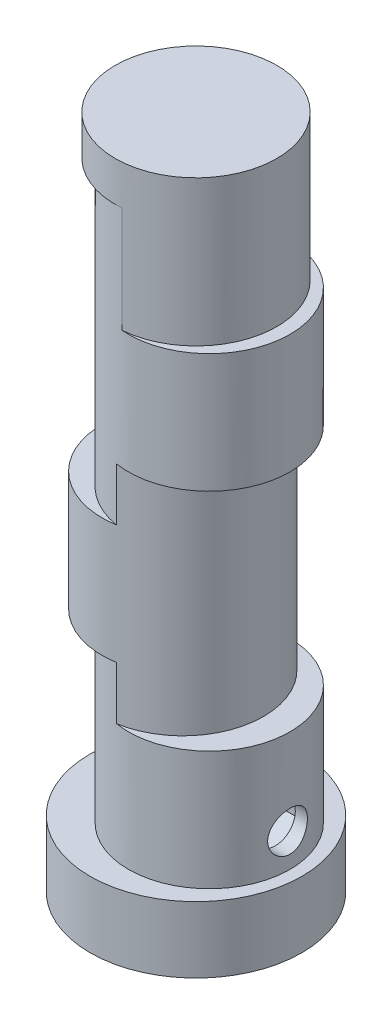
ISO-10303-21;
HEADER;
FILE_DESCRIPTION(('STEP AP214'),'2;1');
FILE_NAME('part.step','',(''),(''),'','','');
FILE_SCHEMA(('AUTOMOTIVE_DESIGN { 1 0 10303 214 1 1 1 1 }'));
ENDSEC;
DATA;
#1=APPLICATION_CONTEXT('core data for automotive mechanical design processes');
#2=APPLICATION_PROTOCOL_DEFINITION('international standard','automotive_design',2000,#1);
#3=PRODUCT_CONTEXT('',#1,'mechanical');
#4=PRODUCT('Part','Part','',(#3));
#5=PRODUCT_RELATED_PRODUCT_CATEGORY('part','',(#4));
#6=PRODUCT_DEFINITION_FORMATION('','',#4);
#7=PRODUCT_DEFINITION_CONTEXT('part definition',#1,'design');
#8=PRODUCT_DEFINITION('design','',#6,#7);
#9=PRODUCT_DEFINITION_SHAPE('','',#8);
#10=(LENGTH_UNIT() NAMED_UNIT(*) SI_UNIT(.MILLI.,.METRE.));
#11=(NAMED_UNIT(*) PLANE_ANGLE_UNIT() SI_UNIT($,.RADIAN.));
#12=(NAMED_UNIT(*) SI_UNIT($,.STERADIAN.) SOLID_ANGLE_UNIT());
#13=UNCERTAINTY_MEASURE_WITH_UNIT(LENGTH_MEASURE(1.E-05),#10,'distance_accuracy_value','');
#14=(GEOMETRIC_REPRESENTATION_CONTEXT(3) GLOBAL_UNCERTAINTY_ASSIGNED_CONTEXT((#13)) GLOBAL_UNIT_ASSIGNED_CONTEXT((#10,
#11,#12)) REPRESENTATION_CONTEXT('',''));
#15=CARTESIAN_POINT('',(0.,0.,0.));
#16=DIRECTION('',(0.,0.,1.));
#17=DIRECTION('',(1.,0.,0.));
#18=AXIS2_PLACEMENT_3D('',#15,#16,#17);
#19=CARTESIAN_POINT('',(0.,25.,0.));
#20=DIRECTION('',(0.,-1.,0.));
#21=DIRECTION('',(0.,0.,-1.));
#22=AXIS2_PLACEMENT_3D('',#19,#20,#21);
#23=CYLINDRICAL_SURFACE('',#22,3.15);
#24=CARTESIAN_POINT('',(0.,0.,0.));
#25=DIRECTION('',(0.,-1.,0.));
#26=DIRECTION('',(0.,0.,-1.));
#27=AXIS2_PLACEMENT_3D('',#24,#25,#26);
#28=CIRCLE('',#27,3.15);
#29=CARTESIAN_POINT('',(0.,0.,-3.15));
#30=VERTEX_POINT('',#29);
#31=EDGE_CURVE('E149',#30,#30,#28,.T.);
#32=ORIENTED_EDGE('',*,*,#31,.T.);
#33=EDGE_LOOP('',(#32));
#34=FACE_BOUND('',#33,.T.);
#35=CARTESIAN_POINT('',(0.,25.,0.));
#36=DIRECTION('',(0.,-1.,0.));
#37=DIRECTION('',(0.,0.,-1.));
#38=AXIS2_PLACEMENT_3D('',#35,#36,#37);
#39=CIRCLE('',#38,3.15);
#40=CARTESIAN_POINT('',(0.,25.,-3.15));
#41=VERTEX_POINT('',#40);
#42=EDGE_CURVE('E160',#41,#41,#39,.T.);
#43=ORIENTED_EDGE('',*,*,#42,.F.);
#44=EDGE_LOOP('',(#43));
#45=FACE_BOUND('',#44,.T.);
#46=CARTESIAN_POINT('',(0.,10.7331615074619,0.));
#47=DIRECTION('',(0.,-0.866025403784439,0.5));
#48=DIRECTION('',(0.,-0.5,-0.866025403784439));
#49=AXIS2_PLACEMENT_3D('',#46,#47,#48);
#50=ELLIPSE('',#49,3.63730669589464,3.15);
#51=CARTESIAN_POINT('',(3.15,10.7331615074619,0.));
#52=VERTEX_POINT('',#51);
#53=CARTESIAN_POINT('',(1.44308696896618,9.11658075373095,-2.8));
#54=VERTEX_POINT('',#53);
#55=EDGE_CURVE('E11',#52,#54,#50,.F.);
#56=ORIENTED_EDGE('',*,*,#55,.F.);
#57=CARTESIAN_POINT('',(0.,10.7331615074619,0.));
#58=DIRECTION('',(0.,-0.866025403784438,-0.5));
#59=DIRECTION('',(0.,-0.5,0.866025403784438));
#60=AXIS2_PLACEMENT_3D('',#57,#58,#59);
#61=ELLIPSE('',#60,3.63730669589464,3.15);
#62=CARTESIAN_POINT('',(1.44308696896618,9.11658075373095,2.8));
#63=VERTEX_POINT('',#62);
#64=EDGE_CURVE('E43',#63,#52,#61,.F.);
#65=ORIENTED_EDGE('',*,*,#64,.F.);
#66=DIRECTION('',(0.,-1.,0.));
#67=VECTOR('',#66,1.);
#68=CARTESIAN_POINT('',(1.44308696896617,25.,2.8));
#69=LINE('',#68,#67);
#70=CARTESIAN_POINT('',(1.44308696896619,5.88341924626905,2.8));
#71=VERTEX_POINT('',#70);
#72=EDGE_CURVE('E259',#71,#63,#69,.F.);
#73=ORIENTED_EDGE('',*,*,#72,.F.);
#74=CARTESIAN_POINT('',(0.,4.2668384925381,0.));
#75=DIRECTION('',(0.,0.866025403784439,-0.5));
#76=DIRECTION('',(0.,-0.5,-0.866025403784439));
#77=AXIS2_PLACEMENT_3D('',#74,#75,#76);
#78=ELLIPSE('',#77,3.63730669589464,3.15);
#79=CARTESIAN_POINT('',(3.15,4.26683849253809,0.));
#80=VERTEX_POINT('',#79);
#81=EDGE_CURVE('E257',#80,#71,#78,.F.);
#82=ORIENTED_EDGE('',*,*,#81,.F.);
#83=CARTESIAN_POINT('',(0.,4.2668384925381,0.));
#84=DIRECTION('',(0.,0.866025403784439,0.5));
#85=DIRECTION('',(0.,-0.5,0.866025403784439));
#86=AXIS2_PLACEMENT_3D('',#83,#84,#85);
#87=ELLIPSE('',#86,3.63730669589464,3.15);
#88=CARTESIAN_POINT('',(1.44308696896618,5.88341924626905,-2.8));
#89=VERTEX_POINT('',#88);
#90=EDGE_CURVE('E255',#89,#80,#87,.F.);
#91=ORIENTED_EDGE('',*,*,#90,.F.);
#92=DIRECTION('',(0.,-1.,0.));
#93=VECTOR('',#92,1.);
#94=CARTESIAN_POINT('',(1.44308696896618,25.,-2.8));
#95=LINE('',#94,#93);
#96=EDGE_CURVE('E251',#54,#89,#95,.T.);
#97=ORIENTED_EDGE('',*,*,#96,.F.);
#98=EDGE_LOOP('',(#56,#65,#73,#82,#91,#97));
#99=FACE_BOUND('',#98,.T.);
#100=ADVANCED_FACE('F35',(#34,#45,#99),#23,.F.);
#101=CARTESIAN_POINT('',(1.,14.,0.));
#102=DIRECTION('',(0.,-1.,0.));
#103=DIRECTION('',(0.,0.,-1.));
#104=AXIS2_PLACEMENT_3D('',#101,#102,#103);
#105=CYLINDRICAL_SURFACE('',#104,6.1);
#106=CARTESIAN_POINT('',(1.,14.,0.));
#107=DIRECTION('',(0.,1.,0.));
#108=DIRECTION('',(0.,0.,1.));
#109=AXIS2_PLACEMENT_3D('',#106,#107,#108);
#110=CIRCLE('',#109,6.1);
#111=CARTESIAN_POINT('',(0.,14.,6.01747455333215));
#112=VERTEX_POINT('',#111);
#113=CARTESIAN_POINT('',(0.,14.,-6.01747455333215));
#114=VERTEX_POINT('',#113);
#115=EDGE_CURVE('E228',#112,#114,#110,.T.);
#116=ORIENTED_EDGE('',*,*,#115,.F.);
#117=DIRECTION('',(0.,-1.,0.));
#118=VECTOR('',#117,1.);
#119=CARTESIAN_POINT('',(0.,18.,6.01747455333215));
#120=LINE('',#119,#118);
#121=CARTESIAN_POINT('',(0.,18.,6.01747455333215));
#122=VERTEX_POINT('',#121);
#123=EDGE_CURVE('E237',#122,#112,#120,.T.);
#124=ORIENTED_EDGE('',*,*,#123,.F.);
#125=CARTESIAN_POINT('',(1.,18.,0.));
#126=DIRECTION('',(0.,1.,0.));
#127=DIRECTION('',(0.,0.,-1.));
#128=AXIS2_PLACEMENT_3D('',#125,#126,#127);
#129=CIRCLE('',#128,6.1);
#130=CARTESIAN_POINT('',(0.,18.,-6.01747455333215));
#131=VERTEX_POINT('',#130);
#132=EDGE_CURVE('E491',#131,#122,#129,.T.);
#133=ORIENTED_EDGE('',*,*,#132,.F.);
#134=DIRECTION('',(0.,-1.,0.));
#135=VECTOR('',#134,1.);
#136=CARTESIAN_POINT('',(0.,18.,-6.01747455333215));
#137=LINE('',#136,#135);
#138=EDGE_CURVE('E239',#131,#114,#137,.T.);
#139=ORIENTED_EDGE('',*,*,#138,.T.);
#140=EDGE_LOOP('',(#116,#124,#133,#139));
#141=FACE_BOUND('',#140,.T.);
#142=CARTESIAN_POINT('',(1.,5.,0.));
#143=DIRECTION('',(0.,1.,0.));
#144=DIRECTION('',(0.,0.,1.));
#145=AXIS2_PLACEMENT_3D('',#142,#143,#144);
#146=CIRCLE('',#145,6.1);
#147=CARTESIAN_POINT('',(1.,5.,6.1));
#148=VERTEX_POINT('',#147);
#149=EDGE_CURVE('E248',#148,#148,#146,.T.);
#150=ORIENTED_EDGE('',*,*,#149,.T.);
#151=EDGE_LOOP('',(#150));
#152=FACE_BOUND('',#151,.T.);
#153=CARTESIAN_POINT('',(6.91269819963779,7.5,1.5));
#154=CARTESIAN_POINT('',(6.9126998060556,7.41712278064616,1.4999975690533));
#155=CARTESIAN_POINT('',(6.9144597343511,7.3342183610392,1.49310797376088));
#156=CARTESIAN_POINT('',(6.92129202077056,7.17078706736375,1.46577363636686));
#157=CARTESIAN_POINT('',(6.92636637043722,7.090261653199,1.44532074434831));
#158=CARTESIAN_POINT('',(6.93921883489659,6.93397594703489,1.39155918794369));
#159=CARTESIAN_POINT('',(6.94699353112061,6.85820977249492,1.35826677220773));
#160=CARTESIAN_POINT('',(6.96436644289978,6.71333076700223,1.27982033209297));
#161=CARTESIAN_POINT('',(6.97396472033899,6.64421816196138,1.23466590515153));
#162=CARTESIAN_POINT('',(6.994132084337,6.51313621507288,1.13275031899138));
#163=CARTESIAN_POINT('',(7.00471626796872,6.45132943399605,1.07578302432095));
#164=CARTESIAN_POINT('',(7.02553174748576,6.3380445657549,0.952302942094368));
#165=CARTESIAN_POINT('',(7.03576301112202,6.28656742043074,0.885789285063226));
#166=CARTESIAN_POINT('',(7.0548865456579,6.19474100793115,0.743994133707522));
#167=CARTESIAN_POINT('',(7.06375892305911,6.15455098028312,0.668606601038824));
#168=CARTESIAN_POINT('',(7.07899300802557,6.08747431780344,0.511891405903731));
#169=CARTESIAN_POINT('',(7.08535507359341,6.06058578586943,0.430564592416675));
#170=CARTESIAN_POINT('',(7.09474498214789,6.02139477930321,0.265973555788015));
#171=CARTESIAN_POINT('',(7.09783581801544,6.00881636945155,0.182778691625863));
#172=CARTESIAN_POINT('',(7.10055435441945,5.99773698857898,0.0154060764093003));
#173=CARTESIAN_POINT('',(7.10018255097244,5.99923400128075,-0.0687715321434836));
#174=CARTESIAN_POINT('',(7.09606476582421,6.01606353614531,-0.233807979580636));
#175=CARTESIAN_POINT('',(7.09239141026846,6.03109827413386,-0.31469926888962));
#176=CARTESIAN_POINT('',(7.0821675675927,6.07409839846138,-0.47277371209518));
#177=CARTESIAN_POINT('',(7.07561693016091,6.10206446034839,-0.549956672031562));
#178=CARTESIAN_POINT('',(7.06026266570478,6.17037737007251,-0.699213839862234));
#179=CARTESIAN_POINT('',(7.05143969560672,6.21083113686827,-0.771237040929525));
#180=CARTESIAN_POINT('',(7.03249929340938,6.30289022076885,-0.907577574612574));
#181=CARTESIAN_POINT('',(7.02238164279837,6.35449742132718,-0.971893602881658));
#182=CARTESIAN_POINT('',(7.00164301846912,6.46899831379271,-1.092769508958));
#183=CARTESIAN_POINT('',(6.99101580290047,6.53215230406986,-1.14908200378442));
#184=CARTESIAN_POINT('',(6.97069917825497,6.66711859706198,-1.25037099898459));
#185=CARTESIAN_POINT('',(6.9610098101475,6.73893127771983,-1.29534700426727));
#186=CARTESIAN_POINT('',(6.94364431591754,6.88964978893113,-1.37283781707484));
#187=CARTESIAN_POINT('',(6.93597757256019,6.96858647377591,-1.4052948607831));
#188=CARTESIAN_POINT('',(6.92364684203902,7.1310295864958,-1.45640197195425));
#189=CARTESIAN_POINT('',(6.91898223595094,7.21453506860794,-1.4750548854123));
#190=CARTESIAN_POINT('',(6.91331334341029,7.38145580682887,-1.49761754049186));
#191=CARTESIAN_POINT('',(6.91221845954046,7.4648187074306,-1.50189228237621));
#192=CARTESIAN_POINT('',(6.91356667440519,7.63106665627221,-1.49657499228901));
#193=CARTESIAN_POINT('',(6.91600945919373,7.71395174625948,-1.48698419079807));
#194=CARTESIAN_POINT('',(6.92407112693765,7.8755477552966,-1.45452765993443));
#195=CARTESIAN_POINT('',(6.92963951335311,7.95430379281553,-1.43187283482642));
#196=CARTESIAN_POINT('',(6.94327735477713,8.10690068833243,-1.37416441539949));
#197=CARTESIAN_POINT('',(6.95134709856602,8.18074097761367,-1.33910938941819));
#198=CARTESIAN_POINT('',(6.96927028778677,8.32296142202863,-1.25682618529392));
#199=CARTESIAN_POINT('',(6.97915477918457,8.39121079291479,-1.20937886701303));
#200=CARTESIAN_POINT('',(6.99951679898271,8.51891296710885,-1.10393633460536));
#201=CARTESIAN_POINT('',(7.00999442134809,8.5783643712025,-1.04593944595464));
#202=CARTESIAN_POINT('',(7.03066802880621,8.68825297516724,-0.91937216051807));
#203=CARTESIAN_POINT('',(7.04085112565722,8.7384381720983,-0.850580476382817));
#204=CARTESIAN_POINT('',(7.05952617800644,8.82654348256262,-0.705333760138861));
#205=CARTESIAN_POINT('',(7.06801822088191,8.86446422986694,-0.628879124284235));
#206=CARTESIAN_POINT('',(7.08230132722743,8.92664040852296,-0.471000549404139));
#207=CARTESIAN_POINT('',(7.08811152219131,8.95099289861433,-0.389616646467804));
#208=CARTESIAN_POINT('',(7.09645990721965,8.98563457452511,-0.22375036041041));
#209=CARTESIAN_POINT('',(7.09899870687083,8.99592638041213,-0.139268557565504));
#210=CARTESIAN_POINT('',(7.10049429717324,9.00201118474049,0.0280246801746187));
#211=CARTESIAN_POINT('',(7.09954311004842,8.99817664854727,0.110821953847459));
#212=CARTESIAN_POINT('',(7.09436871195544,8.97696797358946,0.274553807445335));
#213=CARTESIAN_POINT('',(7.09014559257098,8.95959421379725,0.355488439441739));
#214=CARTESIAN_POINT('',(7.07891508286283,8.91199729273701,0.512821629102314));
#215=CARTESIAN_POINT('',(7.07192187008536,8.88183950676798,0.589241042109928));
#216=CARTESIAN_POINT('',(7.05588891199681,8.80959029231243,0.735978048137526));
#217=CARTESIAN_POINT('',(7.04684891620559,8.76749740307885,0.806294892882455));
#218=CARTESIAN_POINT('',(7.02743560232835,8.67142603985028,0.940604089001307));
#219=CARTESIAN_POINT('',(7.01703613046384,8.61719353693722,1.00441095702599));
#220=CARTESIAN_POINT('',(6.99619657461052,8.49887830086756,1.12214493876253));
#221=CARTESIAN_POINT('',(6.9857564810669,8.4347930941848,1.17606956406009));
#222=CARTESIAN_POINT('',(6.96580567774493,8.29721131025839,1.27345344554276));
#223=CARTESIAN_POINT('',(6.9563149390607,8.22356685756664,1.31670818862077));
#224=CARTESIAN_POINT('',(6.9396034327772,8.06982940747217,1.39015828674302));
#225=CARTESIAN_POINT('',(6.93238097635311,7.98974126372694,1.4203633640981));
#226=CARTESIAN_POINT('',(6.92218173742784,7.84146700957612,1.46223388866919));
#227=CARTESIAN_POINT('',(6.918651718285,7.7740048691783,1.47636584602169));
#228=CARTESIAN_POINT('',(6.91390937399489,7.63770133841782,1.4952495393791));
#229=CARTESIAN_POINT('',(6.91269686491609,7.56886005795025,1.50000201979665));
#230=CARTESIAN_POINT('',(6.91269819963779,7.5,1.5));
#231=B_SPLINE_CURVE_WITH_KNOTS('',3,(#153,#154,#155,#156,#157,#158,#159,#160,#161,#162,#163,
#164,#165,#166,#167,#168,#169,#170,#171,#172,#173,#174,#175,#176,#177,#178,#179,#180,#181,#182,
#183,#184,#185,#186,#187,#188,#189,#190,#191,#192,#193,#194,#195,#196,#197,#198,#199,#200,#201,
#202,#203,#204,#205,#206,#207,#208,#209,#210,#211,#212,#213,#214,#215,#216,#217,#218,#219,#220,
#221,#222,#223,#224,#225,#226,#227,#228,#229,#230),.UNSPECIFIED.,.T.,.F.,(4,2,2,2,2,2,2,2,2,2,2,
2,2,2,2,2,2,2,2,2,2,2,2,2,2,2,2,2,2,2,2,2,2,2,2,2,2,2,4),(0.,0.24837885690484,0.496907095152345,
0.74512184304487,0.993345015722658,1.24633236169315,1.49934276418659,1.75576135729314,
2.01214336859868,2.2634931304781,2.5148068875343,2.76072411155864,3.00665418404864,
3.25475120770569,3.50289015969082,3.75753085945491,4.01218267804883,4.26799581857614,
4.52375620344804,4.77297284269361,5.02216736687253,5.26744726353005,5.5127554881702,
5.76273600030384,6.01275622630207,6.26880679347454,6.52484412700157,6.7790256113672,
7.03315972509691,7.28064169067639,7.52811672931062,7.77434120679789,8.02059583291815,
8.27258686683828,8.52464126684693,8.78120550906606,9.03757827382031,9.24396478394705,
9.45033491331955),.UNSPECIFIED.);
#232=CARTESIAN_POINT('',(6.91269819963779,7.5,1.5));
#233=VERTEX_POINT('',#232);
#234=EDGE_CURVE('E145',#233,#233,#231,.T.);
#235=ORIENTED_EDGE('',*,*,#234,.F.);
#236=EDGE_LOOP('',(#235));
#237=FACE_BOUND('',#236,.T.);
#238=ADVANCED_FACE('F162',(#141,#152,#237),#105,.T.);
#239=CARTESIAN_POINT('',(0.,5.,0.));
#240=DIRECTION('',(0.,-1.,0.));
#241=DIRECTION('',(0.,0.,-1.));
#242=AXIS2_PLACEMENT_3D('',#239,#240,#241);
#243=CYLINDRICAL_SURFACE('',#242,8.);
#244=CARTESIAN_POINT('',(0.,5.,0.));
#245=DIRECTION('',(0.,1.,0.));
#246=DIRECTION('',(0.,0.,1.));
#247=AXIS2_PLACEMENT_3D('',#244,#245,#246);
#248=CIRCLE('',#247,8.);
#249=CARTESIAN_POINT('',(0.,5.,8.));
#250=VERTEX_POINT('',#249);
#251=EDGE_CURVE('E243',#250,#250,#248,.T.);
#252=ORIENTED_EDGE('',*,*,#251,.F.);
#253=EDGE_LOOP('',(#252));
#254=FACE_BOUND('',#253,.T.);
#255=CARTESIAN_POINT('',(0.,0.,0.));
#256=DIRECTION('',(0.,1.,0.));
#257=DIRECTION('',(0.,0.,1.));
#258=AXIS2_PLACEMENT_3D('',#255,#256,#257);
#259=CIRCLE('',#258,8.);
#260=CARTESIAN_POINT('',(0.,0.,8.));
#261=VERTEX_POINT('',#260);
#262=EDGE_CURVE('E240',#261,#261,#259,.T.);
#263=ORIENTED_EDGE('',*,*,#262,.T.);
#264=EDGE_LOOP('',(#263));
#265=FACE_BOUND('',#264,.T.);
#266=ADVANCED_FACE('F37',(#254,#265),#243,.T.);
#267=CARTESIAN_POINT('',(0.,5.,0.));
#268=DIRECTION('',(0.,1.,0.));
#269=DIRECTION('',(0.,0.,1.));
#270=AXIS2_PLACEMENT_3D('',#267,#268,#269);
#271=PLANE('',#270);
#272=ORIENTED_EDGE('',*,*,#149,.F.);
#273=EDGE_LOOP('',(#272));
#274=FACE_BOUND('',#273,.T.);
#275=ORIENTED_EDGE('',*,*,#251,.T.);
#276=EDGE_LOOP('',(#275));
#277=FACE_BOUND('',#276,.T.);
#278=ADVANCED_FACE('F221',(#274,#277),#271,.T.);
#279=CARTESIAN_POINT('',(0.,0.,0.));
#280=DIRECTION('',(0.,1.,0.));
#281=DIRECTION('',(0.,0.,1.));
#282=AXIS2_PLACEMENT_3D('',#279,#280,#281);
#283=PLANE('',#282);
#284=ORIENTED_EDGE('',*,*,#31,.F.);
#285=EDGE_LOOP('',(#284));
#286=FACE_BOUND('',#285,.T.);
#287=ORIENTED_EDGE('',*,*,#262,.F.);
#288=EDGE_LOOP('',(#287));
#289=FACE_BOUND('',#288,.T.);
#290=ADVANCED_FACE('F216',(#286,#289),#283,.F.);
#291=CARTESIAN_POINT('',(1.,14.,0.));
#292=DIRECTION('',(0.,1.,0.));
#293=DIRECTION('',(0.,0.,1.));
#294=AXIS2_PLACEMENT_3D('',#291,#292,#293);
#295=PLANE('',#294);
#296=CARTESIAN_POINT('',(-1.,14.,0.));
#297=DIRECTION('',(0.,1.,0.));
#298=DIRECTION('',(0.,0.,1.));
#299=AXIS2_PLACEMENT_3D('',#296,#297,#298);
#300=CIRCLE('',#299,6.1);
#301=EDGE_CURVE('E226',#112,#114,#300,.T.);
#302=ORIENTED_EDGE('',*,*,#301,.F.);
#303=ORIENTED_EDGE('',*,*,#115,.T.);
#304=EDGE_LOOP('',(#302,#303));
#305=FACE_BOUND('',#304,.T.);
#306=ADVANCED_FACE('F213',(#305),#295,.T.);
#307=CARTESIAN_POINT('',(-1.,31.,0.));
#308=DIRECTION('',(0.,-1.,0.));
#309=DIRECTION('',(0.,0.,-1.));
#310=AXIS2_PLACEMENT_3D('',#307,#308,#309);
#311=CYLINDRICAL_SURFACE('',#310,6.1);
#312=CARTESIAN_POINT('',(-1.,31.,0.));
#313=DIRECTION('',(0.,1.,0.));
#314=DIRECTION('',(0.,0.,1.));
#315=AXIS2_PLACEMENT_3D('',#312,#313,#314);
#316=CIRCLE('',#315,6.1);
#317=CARTESIAN_POINT('',(0.,31.,6.01747455333215));
#318=VERTEX_POINT('',#317);
#319=CARTESIAN_POINT('',(0.,31.,-6.01747455333215));
#320=VERTEX_POINT('',#319);
#321=EDGE_CURVE('E231',#318,#320,#316,.T.);
#322=ORIENTED_EDGE('',*,*,#321,.F.);
#323=DIRECTION('',(0.,1.,0.));
#324=VECTOR('',#323,1.);
#325=CARTESIAN_POINT('',(0.,27.,6.01747455333215));
#326=LINE('',#325,#324);
#327=CARTESIAN_POINT('',(0.,27.,6.01747455333215));
#328=VERTEX_POINT('',#327);
#329=EDGE_CURVE('E478',#328,#318,#326,.T.);
#330=ORIENTED_EDGE('',*,*,#329,.F.);
#331=CARTESIAN_POINT('',(-1.,27.,0.));
#332=DIRECTION('',(0.,1.,0.));
#333=DIRECTION('',(0.,0.,1.));
#334=AXIS2_PLACEMENT_3D('',#331,#332,#333);
#335=CIRCLE('',#334,6.1);
#336=CARTESIAN_POINT('',(0.,27.,-6.01747455333215));
#337=VERTEX_POINT('',#336);
#338=EDGE_CURVE('E484',#337,#328,#335,.T.);
#339=ORIENTED_EDGE('',*,*,#338,.F.);
#340=DIRECTION('',(0.,1.,0.));
#341=VECTOR('',#340,1.);
#342=CARTESIAN_POINT('',(0.,27.,-6.01747455333215));
#343=LINE('',#342,#341);
#344=EDGE_CURVE('E475',#337,#320,#343,.T.);
#345=ORIENTED_EDGE('',*,*,#344,.T.);
#346=EDGE_LOOP('',(#322,#330,#339,#345));
#347=FACE_BOUND('',#346,.T.);
#348=CARTESIAN_POINT('',(-1.,18.,0.));
#349=DIRECTION('',(0.,-1.,0.));
#350=DIRECTION('',(0.,0.,-1.));
#351=AXIS2_PLACEMENT_3D('',#348,#349,#350);
#352=CIRCLE('',#351,6.1);
#353=EDGE_CURVE('E487',#122,#131,#352,.T.);
#354=ORIENTED_EDGE('',*,*,#353,.F.);
#355=ORIENTED_EDGE('',*,*,#123,.T.);
#356=ORIENTED_EDGE('',*,*,#301,.T.);
#357=ORIENTED_EDGE('',*,*,#138,.F.);
#358=EDGE_LOOP('',(#354,#355,#356,#357));
#359=FACE_BOUND('',#358,.T.);
#360=ADVANCED_FACE('F207',(#347,#359),#311,.T.);
#361=CARTESIAN_POINT('',(1.,31.,0.));
#362=DIRECTION('',(0.,1.,0.));
#363=DIRECTION('',(0.,0.,1.));
#364=AXIS2_PLACEMENT_3D('',#361,#362,#363);
#365=PLANE('',#364);
#366=CARTESIAN_POINT('',(1.,31.,0.));
#367=DIRECTION('',(0.,1.,0.));
#368=DIRECTION('',(0.,0.,1.));
#369=AXIS2_PLACEMENT_3D('',#366,#367,#368);
#370=CIRCLE('',#369,6.1);
#371=EDGE_CURVE('E472',#318,#320,#370,.T.);
#372=ORIENTED_EDGE('',*,*,#371,.F.);
#373=ORIENTED_EDGE('',*,*,#321,.T.);
#374=EDGE_LOOP('',(#372,#373));
#375=FACE_BOUND('',#374,.T.);
#376=ADVANCED_FACE('F204',(#375),#365,.F.);
#377=CARTESIAN_POINT('',(1.,40.,0.));
#378=DIRECTION('',(0.,-1.,0.));
#379=DIRECTION('',(0.,0.,-1.));
#380=AXIS2_PLACEMENT_3D('',#377,#378,#379);
#381=CYLINDRICAL_SURFACE('',#380,6.1);
#382=CARTESIAN_POINT('',(1.,40.,0.));
#383=DIRECTION('',(0.,1.,0.));
#384=DIRECTION('',(0.,0.,1.));
#385=AXIS2_PLACEMENT_3D('',#382,#383,#384);
#386=CIRCLE('',#385,6.1);
#387=CARTESIAN_POINT('',(0.499999999999998,40.,6.07947366142827));
#388=VERTEX_POINT('',#387);
#389=CARTESIAN_POINT('',(0.5,40.,-6.07947366142827));
#390=VERTEX_POINT('',#389);
#391=EDGE_CURVE('E232',#388,#390,#386,.T.);
#392=ORIENTED_EDGE('',*,*,#391,.F.);
#393=DIRECTION('',(0.,-1.,0.));
#394=VECTOR('',#393,1.);
#395=CARTESIAN_POINT('',(0.499999999999998,48.,6.07947366142827));
#396=LINE('',#395,#394);
#397=CARTESIAN_POINT('',(0.5,48.,6.07947366142827));
#398=VERTEX_POINT('',#397);
#399=EDGE_CURVE('E500',#398,#388,#396,.T.);
#400=ORIENTED_EDGE('',*,*,#399,.F.);
#401=CARTESIAN_POINT('',(1.,48.,0.));
#402=DIRECTION('',(0.,1.,0.));
#403=DIRECTION('',(0.,0.,-1.));
#404=AXIS2_PLACEMENT_3D('',#401,#402,#403);
#405=CIRCLE('',#404,6.1);
#406=CARTESIAN_POINT('',(0.5,48.,-6.07947366142827));
#407=VERTEX_POINT('',#406);
#408=EDGE_CURVE('E56',#407,#398,#405,.T.);
#409=ORIENTED_EDGE('',*,*,#408,.F.);
#410=DIRECTION('',(0.,-1.,0.));
#411=VECTOR('',#410,1.);
#412=CARTESIAN_POINT('',(0.5,48.,-6.07947366142827));
#413=LINE('',#412,#411);
#414=EDGE_CURVE('E497',#407,#390,#413,.T.);
#415=ORIENTED_EDGE('',*,*,#414,.T.);
#416=EDGE_LOOP('',(#392,#400,#409,#415));
#417=FACE_BOUND('',#416,.T.);
#418=ORIENTED_EDGE('',*,*,#371,.T.);
#419=ORIENTED_EDGE('',*,*,#344,.F.);
#420=CARTESIAN_POINT('',(1.,27.,0.));
#421=DIRECTION('',(0.,-1.,0.));
#422=DIRECTION('',(0.,0.,1.));
#423=AXIS2_PLACEMENT_3D('',#420,#421,#422);
#424=CIRCLE('',#423,6.1);
#425=EDGE_CURVE('E480',#328,#337,#424,.T.);
#426=ORIENTED_EDGE('',*,*,#425,.F.);
#427=ORIENTED_EDGE('',*,*,#329,.T.);
#428=EDGE_LOOP('',(#418,#419,#426,#427));
#429=FACE_BOUND('',#428,.T.);
#430=ADVANCED_FACE('F202',(#417,#429),#381,.T.);
#431=CARTESIAN_POINT('',(1.,40.,0.));
#432=DIRECTION('',(0.,1.,0.));
#433=DIRECTION('',(0.,0.,1.));
#434=AXIS2_PLACEMENT_3D('',#431,#432,#433);
#435=PLANE('',#434);
#436=CARTESIAN_POINT('',(0.,40.,0.));
#437=DIRECTION('',(0.,1.,0.));
#438=DIRECTION('',(0.,0.,1.));
#439=AXIS2_PLACEMENT_3D('',#436,#437,#438);
#440=CIRCLE('',#439,6.1);
#441=EDGE_CURVE('E494',#388,#390,#440,.T.);
#442=ORIENTED_EDGE('',*,*,#441,.F.);
#443=ORIENTED_EDGE('',*,*,#391,.T.);
#444=EDGE_LOOP('',(#442,#443));
#445=FACE_BOUND('',#444,.T.);
#446=ADVANCED_FACE('F198',(#445),#435,.T.);
#447=CARTESIAN_POINT('',(0.,27.,0.));
#448=DIRECTION('',(0.,1.,0.));
#449=DIRECTION('',(0.,0.,1.));
#450=AXIS2_PLACEMENT_3D('',#447,#448,#449);
#451=PLANE('',#450);
#452=ORIENTED_EDGE('',*,*,#338,.T.);
#453=ORIENTED_EDGE('',*,*,#425,.T.);
#454=EDGE_LOOP('',(#452,#453));
#455=FACE_BOUND('',#454,.T.);
#456=ADVANCED_FACE('F194',(#455),#451,.T.);
#457=CARTESIAN_POINT('',(0.,18.,0.));
#458=DIRECTION('',(0.,-1.,0.));
#459=DIRECTION('',(0.,0.,-1.));
#460=AXIS2_PLACEMENT_3D('',#457,#458,#459);
#461=PLANE('',#460);
#462=ORIENTED_EDGE('',*,*,#132,.T.);
#463=ORIENTED_EDGE('',*,*,#353,.T.);
#464=EDGE_LOOP('',(#462,#463));
#465=FACE_BOUND('',#464,.T.);
#466=ADVANCED_FACE('F190',(#465),#461,.T.);
#467=CARTESIAN_POINT('',(0.,51.,0.));
#468=DIRECTION('',(0.,-1.,0.));
#469=DIRECTION('',(0.,0.,-1.));
#470=AXIS2_PLACEMENT_3D('',#467,#468,#469);
#471=CYLINDRICAL_SURFACE('',#470,6.1);
#472=CARTESIAN_POINT('',(0.,51.,0.));
#473=DIRECTION('',(0.,1.,0.));
#474=DIRECTION('',(0.,0.,1.));
#475=AXIS2_PLACEMENT_3D('',#472,#473,#474);
#476=CIRCLE('',#475,6.1);
#477=CARTESIAN_POINT('',(0.,51.,6.1));
#478=VERTEX_POINT('',#477);
#479=EDGE_CURVE('E493',#478,#478,#476,.T.);
#480=ORIENTED_EDGE('',*,*,#479,.F.);
#481=EDGE_LOOP('',(#480));
#482=FACE_BOUND('',#481,.T.);
#483=CARTESIAN_POINT('',(0.,48.,0.));
#484=DIRECTION('',(0.,-1.,0.));
#485=DIRECTION('',(0.,0.,-1.));
#486=AXIS2_PLACEMENT_3D('',#483,#484,#485);
#487=CIRCLE('',#486,6.1);
#488=EDGE_CURVE('E502',#398,#407,#487,.T.);
#489=ORIENTED_EDGE('',*,*,#488,.F.);
#490=ORIENTED_EDGE('',*,*,#399,.T.);
#491=ORIENTED_EDGE('',*,*,#441,.T.);
#492=ORIENTED_EDGE('',*,*,#414,.F.);
#493=EDGE_LOOP('',(#489,#490,#491,#492));
#494=FACE_BOUND('',#493,.T.);
#495=ADVANCED_FACE('F186',(#482,#494),#471,.T.);
#496=CARTESIAN_POINT('',(0.,51.,0.));
#497=DIRECTION('',(0.,1.,0.));
#498=DIRECTION('',(0.,0.,1.));
#499=AXIS2_PLACEMENT_3D('',#496,#497,#498);
#500=PLANE('',#499);
#501=ORIENTED_EDGE('',*,*,#479,.T.);
#502=EDGE_LOOP('',(#501));
#503=FACE_BOUND('',#502,.T.);
#504=ADVANCED_FACE('F183',(#503),#500,.T.);
#505=CARTESIAN_POINT('',(0.5,48.,0.));
#506=DIRECTION('',(0.,-1.,0.));
#507=DIRECTION('',(0.,0.,-1.));
#508=AXIS2_PLACEMENT_3D('',#505,#506,#507);
#509=PLANE('',#508);
#510=ORIENTED_EDGE('',*,*,#408,.T.);
#511=ORIENTED_EDGE('',*,*,#488,.T.);
#512=EDGE_LOOP('',(#510,#511));
#513=FACE_BOUND('',#512,.T.);
#514=ADVANCED_FACE('F176',(#513),#509,.T.);
#515=CARTESIAN_POINT('',(0.,25.,0.));
#516=DIRECTION('',(0.,-1.,0.));
#517=DIRECTION('',(0.,0.,-1.));
#518=AXIS2_PLACEMENT_3D('',#515,#516,#517);
#519=PLANE('',#518);
#520=ORIENTED_EDGE('',*,*,#42,.T.);
#521=EDGE_LOOP('',(#520));
#522=FACE_BOUND('',#521,.T.);
#523=ADVANCED_FACE('F171',(#522),#519,.T.);
#524=CARTESIAN_POINT('',(8.,7.5,0.));
#525=DIRECTION('',(-1.,0.,0.));
#526=DIRECTION('',(0.,0.,1.));
#527=AXIS2_PLACEMENT_3D('',#524,#525,#526);
#528=CYLINDRICAL_SURFACE('',#527,1.5);
#529=CARTESIAN_POINT('',(6.,7.5,0.));
#530=DIRECTION('',(1.,0.,0.));
#531=DIRECTION('',(0.,0.,-1.));
#532=AXIS2_PLACEMENT_3D('',#529,#530,#531);
#533=CIRCLE('',#532,1.5);
#534=CARTESIAN_POINT('',(6.,7.5,-1.5));
#535=VERTEX_POINT('',#534);
#536=EDGE_CURVE('E141',#535,#535,#533,.T.);
#537=ORIENTED_EDGE('',*,*,#536,.F.);
#538=EDGE_LOOP('',(#537));
#539=FACE_BOUND('',#538,.T.);
#540=ORIENTED_EDGE('',*,*,#234,.T.);
#541=EDGE_LOOP('',(#540));
#542=FACE_BOUND('',#541,.T.);
#543=ADVANCED_FACE('F166',(#539,#542),#528,.F.);
#544=CARTESIAN_POINT('',(6.,9.11658075373095,-2.8));
#545=DIRECTION('',(0.,-0.866025403784439,0.5));
#546=DIRECTION('',(0.,-0.5,-0.866025403784439));
#547=AXIS2_PLACEMENT_3D('',#544,#545,#546);
#548=PLANE('',#547);
#549=ORIENTED_EDGE('',*,*,#55,.T.);
#550=DIRECTION('',(-1.,0.,0.));
#551=VECTOR('',#550,1.);
#552=CARTESIAN_POINT('',(6.,9.11658075373095,-2.8));
#553=LINE('',#552,#551);
#554=CARTESIAN_POINT('',(6.,9.11658075373095,-2.8));
#555=VERTEX_POINT('',#554);
#556=EDGE_CURVE('E50',#555,#54,#553,.T.);
#557=ORIENTED_EDGE('',*,*,#556,.F.);
#558=DIRECTION('',(0.,0.5,0.866025403784439));
#559=VECTOR('',#558,1.);
#560=CARTESIAN_POINT('',(6.,9.11658075373095,-2.8));
#561=LINE('',#560,#559);
#562=CARTESIAN_POINT('',(6.,10.7331615074619,0.));
#563=VERTEX_POINT('',#562);
#564=EDGE_CURVE('E128',#555,#563,#561,.T.);
#565=ORIENTED_EDGE('',*,*,#564,.T.);
#566=DIRECTION('',(-1.,0.,0.));
#567=VECTOR('',#566,1.);
#568=CARTESIAN_POINT('',(6.,10.7331615074619,0.));
#569=LINE('',#568,#567);
#570=EDGE_CURVE('E139',#563,#52,#569,.T.);
#571=ORIENTED_EDGE('',*,*,#570,.T.);
#572=EDGE_LOOP('',(#549,#557,#565,#571));
#573=FACE_BOUND('',#572,.T.);
#574=ADVANCED_FACE('F138',(#573),#548,.T.);
#575=CARTESIAN_POINT('',(6.,10.7331615074619,0.));
#576=DIRECTION('',(0.,-0.866025403784438,-0.5));
#577=DIRECTION('',(0.,0.5,-0.866025403784438));
#578=AXIS2_PLACEMENT_3D('',#575,#576,#577);
#579=PLANE('',#578);
#580=ORIENTED_EDGE('',*,*,#64,.T.);
#581=ORIENTED_EDGE('',*,*,#570,.F.);
#582=DIRECTION('',(0.,-0.5,0.866025403784438));
#583=VECTOR('',#582,1.);
#584=CARTESIAN_POINT('',(6.,10.7331615074619,0.));
#585=LINE('',#584,#583);
#586=CARTESIAN_POINT('',(6.,9.11658075373095,2.8));
#587=VERTEX_POINT('',#586);
#588=EDGE_CURVE('E123',#563,#587,#585,.T.);
#589=ORIENTED_EDGE('',*,*,#588,.T.);
#590=DIRECTION('',(-1.,0.,0.));
#591=VECTOR('',#590,1.);
#592=CARTESIAN_POINT('',(6.,9.11658075373095,2.8));
#593=LINE('',#592,#591);
#594=EDGE_CURVE('E146',#587,#63,#593,.T.);
#595=ORIENTED_EDGE('',*,*,#594,.T.);
#596=EDGE_LOOP('',(#580,#581,#589,#595));
#597=FACE_BOUND('',#596,.T.);
#598=ADVANCED_FACE('F143',(#597),#579,.T.);
#599=CARTESIAN_POINT('',(6.,9.11658075373095,2.8));
#600=DIRECTION('',(0.,0.,-1.));
#601=DIRECTION('',(0.,1.,0.));
#602=AXIS2_PLACEMENT_3D('',#599,#600,#601);
#603=PLANE('',#602);
#604=ORIENTED_EDGE('',*,*,#72,.T.);
#605=ORIENTED_EDGE('',*,*,#594,.F.);
#606=DIRECTION('',(0.,-1.,0.));
#607=VECTOR('',#606,1.);
#608=CARTESIAN_POINT('',(6.,9.11658075373095,2.8));
#609=LINE('',#608,#607);
#610=CARTESIAN_POINT('',(6.,5.88341924626905,2.8));
#611=VERTEX_POINT('',#610);
#612=EDGE_CURVE('E130',#587,#611,#609,.T.);
#613=ORIENTED_EDGE('',*,*,#612,.T.);
#614=DIRECTION('',(-1.,0.,0.));
#615=VECTOR('',#614,1.);
#616=CARTESIAN_POINT('',(6.,5.88341924626905,2.8));
#617=LINE('',#616,#615);
#618=EDGE_CURVE('E151',#611,#71,#617,.T.);
#619=ORIENTED_EDGE('',*,*,#618,.T.);
#620=EDGE_LOOP('',(#604,#605,#613,#619));
#621=FACE_BOUND('',#620,.T.);
#622=ADVANCED_FACE('F263',(#621),#603,.T.);
#623=CARTESIAN_POINT('',(6.,5.88341924626905,2.8));
#624=DIRECTION('',(0.,0.866025403784439,-0.5));
#625=DIRECTION('',(0.,0.5,0.866025403784439));
#626=AXIS2_PLACEMENT_3D('',#623,#624,#625);
#627=PLANE('',#626);
#628=ORIENTED_EDGE('',*,*,#81,.T.);
#629=ORIENTED_EDGE('',*,*,#618,.F.);
#630=DIRECTION('',(0.,-0.5,-0.866025403784439));
#631=VECTOR('',#630,1.);
#632=CARTESIAN_POINT('',(6.,5.88341924626905,2.8));
#633=LINE('',#632,#631);
#634=CARTESIAN_POINT('',(6.,4.26683849253809,0.));
#635=VERTEX_POINT('',#634);
#636=EDGE_CURVE('E287',#611,#635,#633,.T.);
#637=ORIENTED_EDGE('',*,*,#636,.T.);
#638=DIRECTION('',(-1.,0.,0.));
#639=VECTOR('',#638,1.);
#640=CARTESIAN_POINT('',(6.,4.26683849253809,0.));
#641=LINE('',#640,#639);
#642=EDGE_CURVE('E279',#635,#80,#641,.T.);
#643=ORIENTED_EDGE('',*,*,#642,.T.);
#644=EDGE_LOOP('',(#628,#629,#637,#643));
#645=FACE_BOUND('',#644,.T.);
#646=ADVANCED_FACE('F368',(#645),#627,.T.);
#647=CARTESIAN_POINT('',(6.,4.26683849253809,0.));
#648=DIRECTION('',(0.,0.866025403784439,0.5));
#649=DIRECTION('',(0.,-0.5,0.866025403784439));
#650=AXIS2_PLACEMENT_3D('',#647,#648,#649);
#651=PLANE('',#650);
#652=ORIENTED_EDGE('',*,*,#90,.T.);
#653=ORIENTED_EDGE('',*,*,#642,.F.);
#654=DIRECTION('',(0.,0.5,-0.866025403784439));
#655=VECTOR('',#654,1.);
#656=CARTESIAN_POINT('',(6.,4.26683849253809,0.));
#657=LINE('',#656,#655);
#658=CARTESIAN_POINT('',(6.,5.88341924626905,-2.8));
#659=VERTEX_POINT('',#658);
#660=EDGE_CURVE('E278',#635,#659,#657,.T.);
#661=ORIENTED_EDGE('',*,*,#660,.T.);
#662=DIRECTION('',(-1.,0.,0.));
#663=VECTOR('',#662,1.);
#664=CARTESIAN_POINT('',(6.,5.88341924626905,-2.8));
#665=LINE('',#664,#663);
#666=EDGE_CURVE('E272',#659,#89,#665,.T.);
#667=ORIENTED_EDGE('',*,*,#666,.T.);
#668=EDGE_LOOP('',(#652,#653,#661,#667));
#669=FACE_BOUND('',#668,.T.);
#670=ADVANCED_FACE('F274',(#669),#651,.T.);
#671=CARTESIAN_POINT('',(6.,5.88341924626905,-2.8));
#672=DIRECTION('',(0.,0.,1.));
#673=DIRECTION('',(1.,0.,0.));
#674=AXIS2_PLACEMENT_3D('',#671,#672,#673);
#675=PLANE('',#674);
#676=ORIENTED_EDGE('',*,*,#96,.T.);
#677=ORIENTED_EDGE('',*,*,#666,.F.);
#678=DIRECTION('',(0.,1.,0.));
#679=VECTOR('',#678,1.);
#680=CARTESIAN_POINT('',(6.,5.88341924626905,-2.8));
#681=LINE('',#680,#679);
#682=EDGE_CURVE('E282',#659,#555,#681,.T.);
#683=ORIENTED_EDGE('',*,*,#682,.T.);
#684=ORIENTED_EDGE('',*,*,#556,.T.);
#685=EDGE_LOOP('',(#676,#677,#683,#684));
#686=FACE_BOUND('',#685,.T.);
#687=ADVANCED_FACE('F271',(#686),#675,.T.);
#688=CARTESIAN_POINT('',(6.,0.,0.));
#689=DIRECTION('',(1.,0.,0.));
#690=DIRECTION('',(0.,0.,-1.));
#691=AXIS2_PLACEMENT_3D('',#688,#689,#690);
#692=PLANE('',#691);
#693=ORIENTED_EDGE('',*,*,#564,.F.);
#694=ORIENTED_EDGE('',*,*,#682,.F.);
#695=ORIENTED_EDGE('',*,*,#660,.F.);
#696=ORIENTED_EDGE('',*,*,#636,.F.);
#697=ORIENTED_EDGE('',*,*,#612,.F.);
#698=ORIENTED_EDGE('',*,*,#588,.F.);
#699=EDGE_LOOP('',(#693,#694,#695,#696,#697,#698));
#700=FACE_BOUND('',#699,.T.);
#701=ORIENTED_EDGE('',*,*,#536,.T.);
#702=EDGE_LOOP('',(#701));
#703=FACE_BOUND('',#702,.T.);
#704=ADVANCED_FACE('F125',(#700,#703),#692,.F.);
#705=CLOSED_SHELL('',(#100,#238,#266,#278,#290,#306,#360,#376,#430,#446,#456,#466,#495,#504,
#514,#523,#543,#574,#598,#622,#646,#670,#687,#704));
#706=MANIFOLD_SOLID_BREP('B2',#705);
#707=ADVANCED_BREP_SHAPE_REPRESENTATION('',(#18,#706),#14);
#708=SHAPE_DEFINITION_REPRESENTATION(#9,#707);
ENDSEC;
END-ISO-10303-21;
